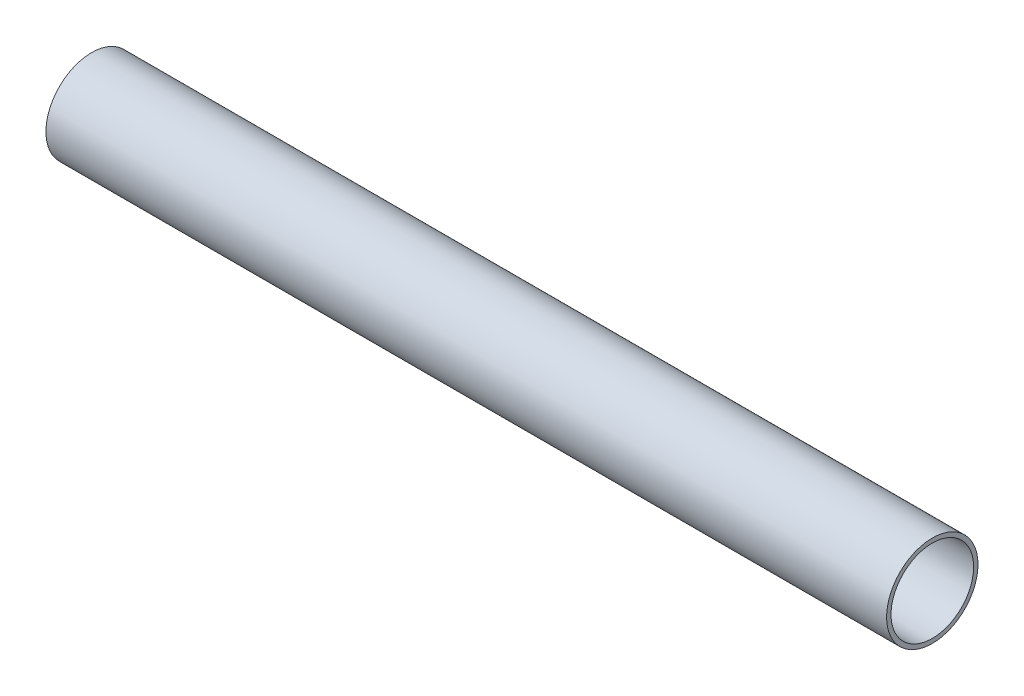
ISO-10303-21;
HEADER;
FILE_DESCRIPTION(('STEP AP214'),'2;1');
FILE_NAME('part.step','',(''),(''),'','','');
FILE_SCHEMA(('AUTOMOTIVE_DESIGN { 1 0 10303 214 1 1 1 1 }'));
ENDSEC;
DATA;
#1=APPLICATION_CONTEXT('core data for automotive mechanical design processes');
#2=APPLICATION_PROTOCOL_DEFINITION('international standard','automotive_design',2000,#1);
#3=PRODUCT_CONTEXT('',#1,'mechanical');
#4=PRODUCT('Part','Part','',(#3));
#5=PRODUCT_RELATED_PRODUCT_CATEGORY('part','',(#4));
#6=PRODUCT_DEFINITION_FORMATION('','',#4);
#7=PRODUCT_DEFINITION_CONTEXT('part definition',#1,'design');
#8=PRODUCT_DEFINITION('design','',#6,#7);
#9=PRODUCT_DEFINITION_SHAPE('','',#8);
#10=(LENGTH_UNIT() NAMED_UNIT(*) SI_UNIT(.MILLI.,.METRE.));
#11=(NAMED_UNIT(*) PLANE_ANGLE_UNIT() SI_UNIT($,.RADIAN.));
#12=(NAMED_UNIT(*) SI_UNIT($,.STERADIAN.) SOLID_ANGLE_UNIT());
#13=UNCERTAINTY_MEASURE_WITH_UNIT(LENGTH_MEASURE(1.E-05),#10,'distance_accuracy_value','');
#14=(GEOMETRIC_REPRESENTATION_CONTEXT(3) GLOBAL_UNCERTAINTY_ASSIGNED_CONTEXT((#13)) GLOBAL_UNIT_ASSIGNED_CONTEXT((#10,
#11,#12)) REPRESENTATION_CONTEXT('',''));
#15=CARTESIAN_POINT('',(0.,0.,0.));
#16=DIRECTION('',(0.,0.,1.));
#17=DIRECTION('',(1.,0.,0.));
#18=AXIS2_PLACEMENT_3D('',#15,#16,#17);
#19=CARTESIAN_POINT('',(115.,920.,-1946.51325703663));
#20=DIRECTION('',(-1.,0.,0.));
#21=DIRECTION('',(0.,0.,1.));
#22=AXIS2_PLACEMENT_3D('',#19,#20,#21);
#23=CYLINDRICAL_SURFACE('',#22,11.3);
#24=CARTESIAN_POINT('',(115.,920.,-1946.51325703663));
#25=DIRECTION('',(1.,0.,0.));
#26=DIRECTION('',(0.,0.,-1.));
#27=AXIS2_PLACEMENT_3D('',#24,#25,#26);
#28=CIRCLE('',#27,11.3);
#29=CARTESIAN_POINT('',(115.,920.,-1957.81325703663));
#30=VERTEX_POINT('',#29);
#31=EDGE_CURVE('E46',#30,#30,#28,.T.);
#32=ORIENTED_EDGE('',*,*,#31,.T.);
#33=EDGE_LOOP('',(#32));
#34=FACE_BOUND('',#33,.T.);
#35=CARTESIAN_POINT('',(-115.,920.,-1946.51325703663));
#36=DIRECTION('',(1.,0.,0.));
#37=DIRECTION('',(0.,0.,-1.));
#38=AXIS2_PLACEMENT_3D('',#35,#36,#37);
#39=CIRCLE('',#38,11.3);
#40=CARTESIAN_POINT('',(-115.,920.,-1957.81325703663));
#41=VERTEX_POINT('',#40);
#42=EDGE_CURVE('E52',#41,#41,#39,.T.);
#43=ORIENTED_EDGE('',*,*,#42,.F.);
#44=EDGE_LOOP('',(#43));
#45=FACE_BOUND('',#44,.T.);
#46=ADVANCED_FACE('F39',(#34,#45),#23,.F.);
#47=CARTESIAN_POINT('',(115.,920.,-1946.51325703663));
#48=DIRECTION('',(-1.,0.,0.));
#49=DIRECTION('',(0.,0.,1.));
#50=AXIS2_PLACEMENT_3D('',#47,#48,#49);
#51=CYLINDRICAL_SURFACE('',#50,12.5);
#52=CARTESIAN_POINT('',(115.,920.,-1946.51325703663));
#53=DIRECTION('',(1.,0.,0.));
#54=DIRECTION('',(0.,0.,-1.));
#55=AXIS2_PLACEMENT_3D('',#52,#53,#54);
#56=CIRCLE('',#55,12.5);
#57=CARTESIAN_POINT('',(115.,920.,-1959.01325703663));
#58=VERTEX_POINT('',#57);
#59=EDGE_CURVE('E10',#58,#58,#56,.T.);
#60=ORIENTED_EDGE('',*,*,#59,.F.);
#61=EDGE_LOOP('',(#60));
#62=FACE_BOUND('',#61,.T.);
#63=CARTESIAN_POINT('',(-115.,920.,-1946.51325703663));
#64=DIRECTION('',(1.,0.,0.));
#65=DIRECTION('',(0.,0.,-1.));
#66=AXIS2_PLACEMENT_3D('',#63,#64,#65);
#67=CIRCLE('',#66,12.5);
#68=CARTESIAN_POINT('',(-115.,920.,-1959.01325703663));
#69=VERTEX_POINT('',#68);
#70=EDGE_CURVE('E42',#69,#69,#67,.T.);
#71=ORIENTED_EDGE('',*,*,#70,.T.);
#72=EDGE_LOOP('',(#71));
#73=FACE_BOUND('',#72,.T.);
#74=ADVANCED_FACE('F59',(#62,#73),#51,.T.);
#75=CARTESIAN_POINT('',(115.,920.,-1946.51325703663));
#76=DIRECTION('',(1.,0.,0.));
#77=DIRECTION('',(0.,0.,-1.));
#78=AXIS2_PLACEMENT_3D('',#75,#76,#77);
#79=PLANE('',#78);
#80=ORIENTED_EDGE('',*,*,#31,.F.);
#81=EDGE_LOOP('',(#80));
#82=FACE_BOUND('',#81,.T.);
#83=ORIENTED_EDGE('',*,*,#59,.T.);
#84=EDGE_LOOP('',(#83));
#85=FACE_BOUND('',#84,.T.);
#86=ADVANCED_FACE('F63',(#82,#85),#79,.T.);
#87=CARTESIAN_POINT('',(-115.,920.,-1946.51325703663));
#88=DIRECTION('',(1.,0.,0.));
#89=DIRECTION('',(0.,0.,-1.));
#90=AXIS2_PLACEMENT_3D('',#87,#88,#89);
#91=PLANE('',#90);
#92=ORIENTED_EDGE('',*,*,#42,.T.);
#93=EDGE_LOOP('',(#92));
#94=FACE_BOUND('',#93,.T.);
#95=ORIENTED_EDGE('',*,*,#70,.F.);
#96=EDGE_LOOP('',(#95));
#97=FACE_BOUND('',#96,.T.);
#98=ADVANCED_FACE('F61',(#94,#97),#91,.F.);
#99=CLOSED_SHELL('',(#46,#74,#86,#98));
#100=MANIFOLD_SOLID_BREP('B2',#99);
#101=ADVANCED_BREP_SHAPE_REPRESENTATION('',(#18,#100),#14);
#102=SHAPE_DEFINITION_REPRESENTATION(#9,#101);
ENDSEC;
END-ISO-10303-21;
